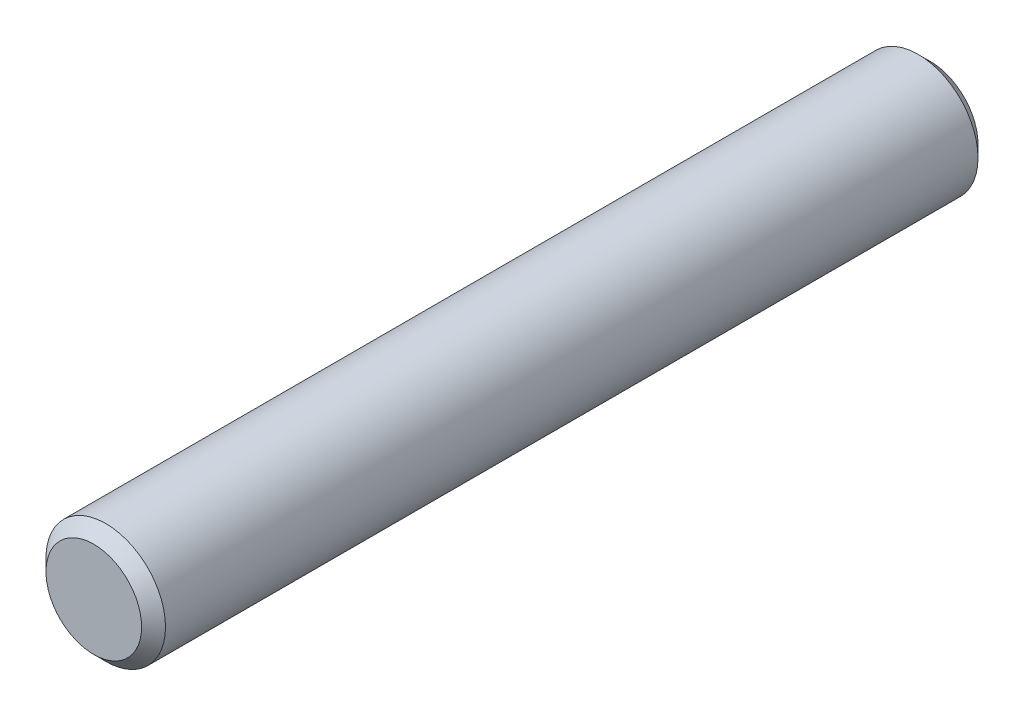
ISO-10303-21;
HEADER;
FILE_DESCRIPTION(('STEP AP214'),'2;1');
FILE_NAME('part.step','',(''),(''),'','','');
FILE_SCHEMA(('AUTOMOTIVE_DESIGN { 1 0 10303 214 1 1 1 1 }'));
ENDSEC;
DATA;
#1=APPLICATION_CONTEXT('core data for automotive mechanical design processes');
#2=APPLICATION_PROTOCOL_DEFINITION('international standard','automotive_design',2000,#1);
#3=PRODUCT_CONTEXT('',#1,'mechanical');
#4=PRODUCT('Part','Part','',(#3));
#5=PRODUCT_RELATED_PRODUCT_CATEGORY('part','',(#4));
#6=PRODUCT_DEFINITION_FORMATION('','',#4);
#7=PRODUCT_DEFINITION_CONTEXT('part definition',#1,'design');
#8=PRODUCT_DEFINITION('design','',#6,#7);
#9=PRODUCT_DEFINITION_SHAPE('','',#8);
#10=(LENGTH_UNIT() NAMED_UNIT(*) SI_UNIT(.MILLI.,.METRE.));
#11=(NAMED_UNIT(*) PLANE_ANGLE_UNIT() SI_UNIT($,.RADIAN.));
#12=(NAMED_UNIT(*) SI_UNIT($,.STERADIAN.) SOLID_ANGLE_UNIT());
#13=UNCERTAINTY_MEASURE_WITH_UNIT(LENGTH_MEASURE(1.E-05),#10,'distance_accuracy_value','');
#14=(GEOMETRIC_REPRESENTATION_CONTEXT(3) GLOBAL_UNCERTAINTY_ASSIGNED_CONTEXT((#13)) GLOBAL_UNIT_ASSIGNED_CONTEXT((#10,
#11,#12)) REPRESENTATION_CONTEXT('',''));
#15=CARTESIAN_POINT('',(0.,0.,0.));
#16=DIRECTION('',(0.,0.,1.));
#17=DIRECTION('',(1.,0.,0.));
#18=AXIS2_PLACEMENT_3D('',#15,#16,#17);
#19=CARTESIAN_POINT('',(0.,0.,44.45));
#20=DIRECTION('',(0.,0.,-1.));
#21=DIRECTION('',(-1.,0.,0.));
#22=AXIS2_PLACEMENT_3D('',#19,#20,#21);
#23=CYLINDRICAL_SURFACE('',#22,6.35);
#24=CARTESIAN_POINT('',(0.,0.,-43.18));
#25=DIRECTION('',(0.,0.,1.));
#26=DIRECTION('',(1.,0.,0.));
#27=AXIS2_PLACEMENT_3D('',#24,#25,#26);
#28=CIRCLE('',#27,6.35);
#29=CARTESIAN_POINT('',(6.35,0.,-43.18));
#30=VERTEX_POINT('',#29);
#31=EDGE_CURVE('E50',#30,#30,#28,.T.);
#32=ORIENTED_EDGE('',*,*,#31,.T.);
#33=EDGE_LOOP('',(#32));
#34=FACE_BOUND('',#33,.T.);
#35=CARTESIAN_POINT('',(0.,0.,43.18));
#36=DIRECTION('',(0.,0.,1.));
#37=DIRECTION('',(1.,0.,0.));
#38=AXIS2_PLACEMENT_3D('',#35,#36,#37);
#39=CIRCLE('',#38,6.35);
#40=CARTESIAN_POINT('',(6.35,0.,43.18));
#41=VERTEX_POINT('',#40);
#42=EDGE_CURVE('E55',#41,#41,#39,.F.);
#43=ORIENTED_EDGE('',*,*,#42,.T.);
#44=EDGE_LOOP('',(#43));
#45=FACE_BOUND('',#44,.T.);
#46=ADVANCED_FACE('F37',(#34,#45),#23,.T.);
#47=CARTESIAN_POINT('',(0.,0.,44.45));
#48=DIRECTION('',(0.,0.,1.));
#49=DIRECTION('',(1.,0.,0.));
#50=AXIS2_PLACEMENT_3D('',#47,#48,#49);
#51=PLANE('',#50);
#52=CARTESIAN_POINT('',(0.,0.,44.45));
#53=DIRECTION('',(0.,0.,1.));
#54=DIRECTION('',(1.,0.,0.));
#55=AXIS2_PLACEMENT_3D('',#52,#53,#54);
#56=CIRCLE('',#55,5.08);
#57=CARTESIAN_POINT('',(5.08,0.,44.45));
#58=VERTEX_POINT('',#57);
#59=EDGE_CURVE('E10',#58,#58,#56,.T.);
#60=ORIENTED_EDGE('',*,*,#59,.T.);
#61=EDGE_LOOP('',(#60));
#62=FACE_BOUND('',#61,.T.);
#63=ADVANCED_FACE('F72',(#62),#51,.T.);
#64=CARTESIAN_POINT('',(0.,0.,-44.45));
#65=DIRECTION('',(0.,0.,1.));
#66=DIRECTION('',(1.,0.,0.));
#67=AXIS2_PLACEMENT_3D('',#64,#65,#66);
#68=PLANE('',#67);
#69=CARTESIAN_POINT('',(0.,0.,-44.45));
#70=DIRECTION('',(0.,0.,1.));
#71=DIRECTION('',(1.,0.,0.));
#72=AXIS2_PLACEMENT_3D('',#69,#70,#71);
#73=CIRCLE('',#72,5.08);
#74=CARTESIAN_POINT('',(5.08,0.,-44.45));
#75=VERTEX_POINT('',#74);
#76=EDGE_CURVE('E45',#75,#75,#73,.F.);
#77=ORIENTED_EDGE('',*,*,#76,.T.);
#78=EDGE_LOOP('',(#77));
#79=FACE_BOUND('',#78,.T.);
#80=ADVANCED_FACE('F69',(#79),#68,.F.);
#81=CARTESIAN_POINT('',(0.,0.,-43.18));
#82=DIRECTION('',(0.,0.,1.));
#83=DIRECTION('',(1.,0.,0.));
#84=AXIS2_PLACEMENT_3D('',#81,#82,#83);
#85=CONICAL_SURFACE('',#84,6.35,0.78539816339745);
#86=ORIENTED_EDGE('',*,*,#76,.F.);
#87=EDGE_LOOP('',(#86));
#88=FACE_BOUND('',#87,.T.);
#89=ORIENTED_EDGE('',*,*,#31,.F.);
#90=EDGE_LOOP('',(#89));
#91=FACE_BOUND('',#90,.T.);
#92=ADVANCED_FACE('F65',(#88,#91),#85,.T.);
#93=CARTESIAN_POINT('',(0.,0.,44.45));
#94=DIRECTION('',(0.,0.,-1.));
#95=DIRECTION('',(-1.,0.,0.));
#96=AXIS2_PLACEMENT_3D('',#93,#94,#95);
#97=CONICAL_SURFACE('',#96,5.08,0.785398163397445);
#98=ORIENTED_EDGE('',*,*,#42,.F.);
#99=EDGE_LOOP('',(#98));
#100=FACE_BOUND('',#99,.T.);
#101=ORIENTED_EDGE('',*,*,#59,.F.);
#102=EDGE_LOOP('',(#101));
#103=FACE_BOUND('',#102,.T.);
#104=ADVANCED_FACE('F39',(#100,#103),#97,.T.);
#105=CLOSED_SHELL('',(#46,#63,#80,#92,#104));
#106=MANIFOLD_SOLID_BREP('B2',#105);
#107=ADVANCED_BREP_SHAPE_REPRESENTATION('',(#18,#106),#14);
#108=SHAPE_DEFINITION_REPRESENTATION(#9,#107);
ENDSEC;
END-ISO-10303-21;
